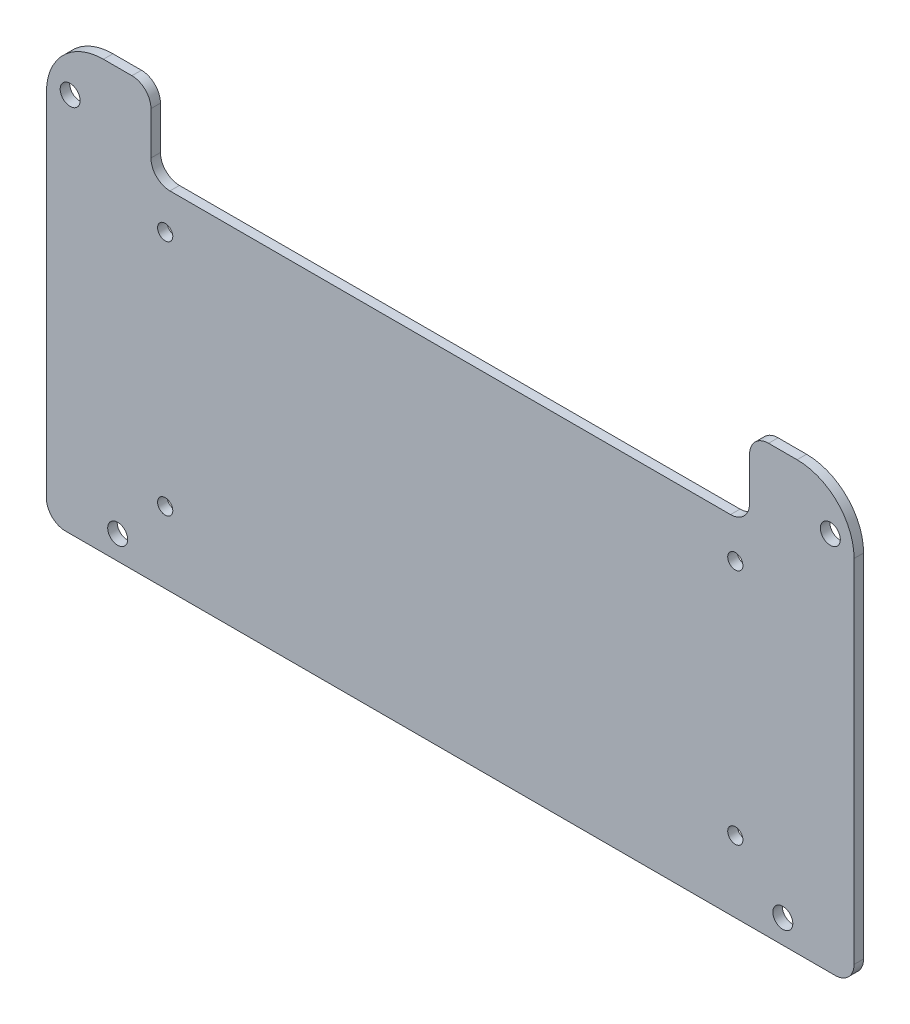
ISO-10303-21;
HEADER;
FILE_DESCRIPTION(('STEP AP214'),'2;1');
FILE_NAME('part.step','',(''),(''),'','','');
FILE_SCHEMA(('AUTOMOTIVE_DESIGN { 1 0 10303 214 1 1 1 1 }'));
ENDSEC;
DATA;
#1=APPLICATION_CONTEXT('core data for automotive mechanical design processes');
#2=APPLICATION_PROTOCOL_DEFINITION('international standard','automotive_design',2000,#1);
#3=PRODUCT_CONTEXT('',#1,'mechanical');
#4=PRODUCT('Part','Part','',(#3));
#5=PRODUCT_RELATED_PRODUCT_CATEGORY('part','',(#4));
#6=PRODUCT_DEFINITION_FORMATION('','',#4);
#7=PRODUCT_DEFINITION_CONTEXT('part definition',#1,'design');
#8=PRODUCT_DEFINITION('design','',#6,#7);
#9=PRODUCT_DEFINITION_SHAPE('','',#8);
#10=(LENGTH_UNIT() NAMED_UNIT(*) SI_UNIT(.MILLI.,.METRE.));
#11=(NAMED_UNIT(*) PLANE_ANGLE_UNIT() SI_UNIT($,.RADIAN.));
#12=(NAMED_UNIT(*) SI_UNIT($,.STERADIAN.) SOLID_ANGLE_UNIT());
#13=UNCERTAINTY_MEASURE_WITH_UNIT(LENGTH_MEASURE(1.E-05),#10,'distance_accuracy_value','');
#14=(GEOMETRIC_REPRESENTATION_CONTEXT(3) GLOBAL_UNCERTAINTY_ASSIGNED_CONTEXT((#13)) GLOBAL_UNIT_ASSIGNED_CONTEXT((#10,
#11,#12)) REPRESENTATION_CONTEXT('',''));
#15=CARTESIAN_POINT('',(0.,0.,0.));
#16=DIRECTION('',(0.,0.,1.));
#17=DIRECTION('',(1.,0.,0.));
#18=AXIS2_PLACEMENT_3D('',#15,#16,#17);
#19=CARTESIAN_POINT('',(-95.625,57.7896341463415,2.));
#20=DIRECTION('',(0.,-1.,0.));
#21=DIRECTION('',(0.,0.,-1.));
#22=AXIS2_PLACEMENT_3D('',#19,#20,#21);
#23=PLANE('',#22);
#24=DIRECTION('',(-1.,0.,0.));
#25=VECTOR('',#24,1.);
#26=CARTESIAN_POINT('',(-95.625,57.7896341463415,0.));
#27=LINE('',#26,#25);
#28=CARTESIAN_POINT('',(-77.625,57.7896341463415,0.));
#29=VERTEX_POINT('',#28);
#30=CARTESIAN_POINT('',(-83.625,57.7896341463415,0.));
#31=VERTEX_POINT('',#30);
#32=EDGE_CURVE('E177',#29,#31,#27,.T.);
#33=ORIENTED_EDGE('',*,*,#32,.T.);
#34=DIRECTION('',(0.,0.,-1.));
#35=VECTOR('',#34,1.);
#36=CARTESIAN_POINT('',(-83.625,57.7896341463415,2.));
#37=LINE('',#36,#35);
#38=CARTESIAN_POINT('',(-83.625,57.7896341463415,2.));
#39=VERTEX_POINT('',#38);
#40=EDGE_CURVE('E253',#31,#39,#37,.F.);
#41=ORIENTED_EDGE('',*,*,#40,.T.);
#42=DIRECTION('',(-1.,0.,0.));
#43=VECTOR('',#42,1.);
#44=CARTESIAN_POINT('',(-95.625,57.7896341463415,2.));
#45=LINE('',#44,#43);
#46=CARTESIAN_POINT('',(-77.625,57.7896341463415,2.));
#47=VERTEX_POINT('',#46);
#48=EDGE_CURVE('E310',#47,#39,#45,.T.);
#49=ORIENTED_EDGE('',*,*,#48,.F.);
#50=DIRECTION('',(0.,0.,1.));
#51=VECTOR('',#50,1.);
#52=CARTESIAN_POINT('',(-77.625,57.7896341463415,2.));
#53=LINE('',#52,#51);
#54=EDGE_CURVE('E236',#47,#29,#53,.F.);
#55=ORIENTED_EDGE('',*,*,#54,.T.);
#56=EDGE_LOOP('',(#33,#41,#49,#55));
#57=FACE_BOUND('',#56,.T.);
#58=ADVANCED_FACE('F36',(#57),#23,.F.);
#59=CARTESIAN_POINT('',(-95.625,57.7896341463415,2.));
#60=DIRECTION('',(1.,0.,0.));
#61=DIRECTION('',(0.,1.,0.));
#62=AXIS2_PLACEMENT_3D('',#59,#60,#61);
#63=PLANE('',#62);
#64=DIRECTION('',(0.,-1.,0.));
#65=VECTOR('',#64,1.);
#66=CARTESIAN_POINT('',(-95.625,57.7896341463415,2.));
#67=LINE('',#66,#65);
#68=CARTESIAN_POINT('',(-95.625,45.7896341463415,2.));
#69=VERTEX_POINT('',#68);
#70=CARTESIAN_POINT('',(-95.625,-28.2103658536585,2.));
#71=VERTEX_POINT('',#70);
#72=EDGE_CURVE('E185',#69,#71,#67,.T.);
#73=ORIENTED_EDGE('',*,*,#72,.F.);
#74=DIRECTION('',(0.,0.,-1.));
#75=VECTOR('',#74,1.);
#76=CARTESIAN_POINT('',(-95.625,45.7896341463415,2.));
#77=LINE('',#76,#75);
#78=CARTESIAN_POINT('',(-95.625,45.7896341463415,0.));
#79=VERTEX_POINT('',#78);
#80=EDGE_CURVE('E246',#69,#79,#77,.T.);
#81=ORIENTED_EDGE('',*,*,#80,.T.);
#82=DIRECTION('',(0.,-1.,0.));
#83=VECTOR('',#82,1.);
#84=CARTESIAN_POINT('',(-95.625,57.7896341463415,0.));
#85=LINE('',#84,#83);
#86=CARTESIAN_POINT('',(-95.625,-28.2103658536585,0.));
#87=VERTEX_POINT('',#86);
#88=EDGE_CURVE('E175',#79,#87,#85,.T.);
#89=ORIENTED_EDGE('',*,*,#88,.T.);
#90=DIRECTION('',(0.,0.,-1.));
#91=VECTOR('',#90,1.);
#92=CARTESIAN_POINT('',(-95.625,-28.2103658536585,2.));
#93=LINE('',#92,#91);
#94=EDGE_CURVE('E156',#87,#71,#93,.F.);
#95=ORIENTED_EDGE('',*,*,#94,.T.);
#96=EDGE_LOOP('',(#73,#81,#89,#95));
#97=FACE_BOUND('',#96,.T.);
#98=ADVANCED_FACE('F322',(#97),#63,.F.);
#99=CARTESIAN_POINT('',(-95.625,-32.2103658536585,2.));
#100=DIRECTION('',(0.,1.,0.));
#101=DIRECTION('',(0.,0.,1.));
#102=AXIS2_PLACEMENT_3D('',#99,#100,#101);
#103=PLANE('',#102);
#104=DIRECTION('',(1.,0.,0.));
#105=VECTOR('',#104,1.);
#106=CARTESIAN_POINT('',(-95.625,-32.2103658536585,2.));
#107=LINE('',#106,#105);
#108=CARTESIAN_POINT('',(-91.625,-32.2103658536585,2.));
#109=VERTEX_POINT('',#108);
#110=CARTESIAN_POINT('',(70.375,-32.2103658536585,2.));
#111=VERTEX_POINT('',#110);
#112=EDGE_CURVE('E169',#109,#111,#107,.T.);
#113=ORIENTED_EDGE('',*,*,#112,.F.);
#114=DIRECTION('',(0.,0.,-1.));
#115=VECTOR('',#114,1.);
#116=CARTESIAN_POINT('',(-91.625,-32.2103658536585,2.));
#117=LINE('',#116,#115);
#118=CARTESIAN_POINT('',(-91.625,-32.2103658536585,0.));
#119=VERTEX_POINT('',#118);
#120=EDGE_CURVE('E154',#109,#119,#117,.T.);
#121=ORIENTED_EDGE('',*,*,#120,.T.);
#122=DIRECTION('',(1.,0.,0.));
#123=VECTOR('',#122,1.);
#124=CARTESIAN_POINT('',(-95.625,-32.2103658536585,0.));
#125=LINE('',#124,#123);
#126=CARTESIAN_POINT('',(70.375,-32.2103658536585,0.));
#127=VERTEX_POINT('',#126);
#128=EDGE_CURVE('E166',#119,#127,#125,.T.);
#129=ORIENTED_EDGE('',*,*,#128,.T.);
#130=DIRECTION('',(0.,0.,-1.));
#131=VECTOR('',#130,1.);
#132=CARTESIAN_POINT('',(70.375,-32.2103658536585,2.));
#133=LINE('',#132,#131);
#134=EDGE_CURVE('E170',#127,#111,#133,.F.);
#135=ORIENTED_EDGE('',*,*,#134,.T.);
#136=EDGE_LOOP('',(#113,#121,#129,#135));
#137=FACE_BOUND('',#136,.T.);
#138=ADVANCED_FACE('F165',(#137),#103,.F.);
#139=CARTESIAN_POINT('',(74.375,57.7896341463415,2.));
#140=DIRECTION('',(-1.,0.,0.));
#141=DIRECTION('',(0.,0.,1.));
#142=AXIS2_PLACEMENT_3D('',#139,#140,#141);
#143=PLANE('',#142);
#144=DIRECTION('',(0.,1.,0.));
#145=VECTOR('',#144,1.);
#146=CARTESIAN_POINT('',(74.375,57.7896341463415,0.));
#147=LINE('',#146,#145);
#148=CARTESIAN_POINT('',(74.375,-28.2103658536585,0.));
#149=VERTEX_POINT('',#148);
#150=CARTESIAN_POINT('',(74.375,45.7896341463415,0.));
#151=VERTEX_POINT('',#150);
#152=EDGE_CURVE('E174',#149,#151,#147,.T.);
#153=ORIENTED_EDGE('',*,*,#152,.T.);
#154=DIRECTION('',(0.,0.,-1.));
#155=VECTOR('',#154,1.);
#156=CARTESIAN_POINT('',(74.375,45.7896341463415,2.));
#157=LINE('',#156,#155);
#158=CARTESIAN_POINT('',(74.375,45.7896341463415,2.));
#159=VERTEX_POINT('',#158);
#160=EDGE_CURVE('E11',#151,#159,#157,.F.);
#161=ORIENTED_EDGE('',*,*,#160,.T.);
#162=DIRECTION('',(0.,1.,0.));
#163=VECTOR('',#162,1.);
#164=CARTESIAN_POINT('',(74.375,57.7896341463415,2.));
#165=LINE('',#164,#163);
#166=CARTESIAN_POINT('',(74.375,-28.2103658536585,2.));
#167=VERTEX_POINT('',#166);
#168=EDGE_CURVE('E309',#167,#159,#165,.T.);
#169=ORIENTED_EDGE('',*,*,#168,.F.);
#170=DIRECTION('',(0.,0.,-1.));
#171=VECTOR('',#170,1.);
#172=CARTESIAN_POINT('',(74.375,-28.2103658536585,2.));
#173=LINE('',#172,#171);
#174=EDGE_CURVE('E206',#167,#149,#173,.T.);
#175=ORIENTED_EDGE('',*,*,#174,.T.);
#176=EDGE_LOOP('',(#153,#161,#169,#175));
#177=FACE_BOUND('',#176,.T.);
#178=ADVANCED_FACE('F395',(#177),#143,.F.);
#179=CARTESIAN_POINT('',(62.3750000000001,57.7896341463415,2.));
#180=VERTEX_POINT('',#179);
#181=CARTESIAN_POINT('',(56.375,57.7896341463415,2.));
#182=VERTEX_POINT('',#181);
#183=EDGE_CURVE('E198',#180,#182,#45,.T.);
#184=ORIENTED_EDGE('',*,*,#183,.F.);
#185=DIRECTION('',(0.,0.,-1.));
#186=VECTOR('',#185,1.);
#187=CARTESIAN_POINT('',(62.3750000000001,57.7896341463415,2.));
#188=LINE('',#187,#186);
#189=CARTESIAN_POINT('',(62.3750000000001,57.7896341463415,0.));
#190=VERTEX_POINT('',#189);
#191=EDGE_CURVE('E44',#180,#190,#188,.T.);
#192=ORIENTED_EDGE('',*,*,#191,.T.);
#193=CARTESIAN_POINT('',(56.375,57.7896341463415,0.));
#194=VERTEX_POINT('',#193);
#195=EDGE_CURVE('E183',#190,#194,#27,.T.);
#196=ORIENTED_EDGE('',*,*,#195,.T.);
#197=DIRECTION('',(0.,0.,1.));
#198=VECTOR('',#197,1.);
#199=CARTESIAN_POINT('',(56.375,57.7896341463415,2.));
#200=LINE('',#199,#198);
#201=EDGE_CURVE('E219',#194,#182,#200,.T.);
#202=ORIENTED_EDGE('',*,*,#201,.T.);
#203=EDGE_LOOP('',(#184,#192,#196,#202));
#204=FACE_BOUND('',#203,.T.);
#205=ADVANCED_FACE('F261',(#204),#23,.F.);
#206=CARTESIAN_POINT('',(0.,0.,2.));
#207=DIRECTION('',(0.,0.,1.));
#208=DIRECTION('',(1.,0.,0.));
#209=AXIS2_PLACEMENT_3D('',#206,#207,#208);
#210=PLANE('',#209);
#211=CARTESIAN_POINT('',(-70.625,32.7896341463415,2.));
#212=DIRECTION('',(0.,0.,1.));
#213=DIRECTION('',(-1.,0.,0.));
#214=AXIS2_PLACEMENT_3D('',#211,#212,#213);
#215=CIRCLE('',#214,1.60000000000001);
#216=CARTESIAN_POINT('',(-72.225,32.7896341463415,2.));
#217=VERTEX_POINT('',#216);
#218=EDGE_CURVE('E342',#217,#217,#215,.T.);
#219=ORIENTED_EDGE('',*,*,#218,.F.);
#220=EDGE_LOOP('',(#219));
#221=FACE_BOUND('',#220,.T.);
#222=CARTESIAN_POINT('',(-70.625,-17.2103658536585,2.));
#223=DIRECTION('',(0.,0.,1.));
#224=DIRECTION('',(-1.,0.,0.));
#225=AXIS2_PLACEMENT_3D('',#222,#223,#224);
#226=CIRCLE('',#225,1.59999999999999);
#227=CARTESIAN_POINT('',(-72.225,-17.2103658536585,2.));
#228=VERTEX_POINT('',#227);
#229=EDGE_CURVE('E348',#228,#228,#226,.T.);
#230=ORIENTED_EDGE('',*,*,#229,.F.);
#231=EDGE_LOOP('',(#230));
#232=FACE_BOUND('',#231,.T.);
#233=CARTESIAN_POINT('',(49.3750000000001,-17.2103658536585,2.));
#234=DIRECTION('',(0.,0.,1.));
#235=DIRECTION('',(1.,0.,0.));
#236=AXIS2_PLACEMENT_3D('',#233,#234,#235);
#237=CIRCLE('',#236,1.6);
#238=CARTESIAN_POINT('',(50.9750000000001,-17.2103658536585,2.));
#239=VERTEX_POINT('',#238);
#240=EDGE_CURVE('E354',#239,#239,#237,.T.);
#241=ORIENTED_EDGE('',*,*,#240,.F.);
#242=EDGE_LOOP('',(#241));
#243=FACE_BOUND('',#242,.T.);
#244=CARTESIAN_POINT('',(49.375,32.7896341463415,2.));
#245=DIRECTION('',(0.,0.,1.));
#246=DIRECTION('',(1.,0.,0.));
#247=AXIS2_PLACEMENT_3D('',#244,#245,#246);
#248=CIRCLE('',#247,1.60000000000001);
#249=CARTESIAN_POINT('',(50.975,32.7896341463415,2.));
#250=VERTEX_POINT('',#249);
#251=EDGE_CURVE('E288',#250,#250,#248,.T.);
#252=ORIENTED_EDGE('',*,*,#251,.F.);
#253=EDGE_LOOP('',(#252));
#254=FACE_BOUND('',#253,.T.);
#255=ORIENTED_EDGE('',*,*,#48,.T.);
#256=CARTESIAN_POINT('',(-83.625,45.7896341463415,2.));
#257=DIRECTION('',(0.,0.,1.));
#258=DIRECTION('',(1.,0.,0.));
#259=AXIS2_PLACEMENT_3D('',#256,#257,#258);
#260=CIRCLE('',#259,12.);
#261=EDGE_CURVE('E256',#39,#69,#260,.T.);
#262=ORIENTED_EDGE('',*,*,#261,.T.);
#263=ORIENTED_EDGE('',*,*,#72,.T.);
#264=CARTESIAN_POINT('',(-91.625,-28.2103658536585,2.));
#265=DIRECTION('',(0.,0.,1.));
#266=DIRECTION('',(1.,0.,0.));
#267=AXIS2_PLACEMENT_3D('',#264,#265,#266);
#268=CIRCLE('',#267,4.);
#269=EDGE_CURVE('E204',#71,#109,#268,.T.);
#270=ORIENTED_EDGE('',*,*,#269,.T.);
#271=ORIENTED_EDGE('',*,*,#112,.T.);
#272=CARTESIAN_POINT('',(70.375,-28.2103658536585,2.));
#273=DIRECTION('',(0.,0.,1.));
#274=DIRECTION('',(1.,0.,0.));
#275=AXIS2_PLACEMENT_3D('',#272,#273,#274);
#276=CIRCLE('',#275,4.);
#277=EDGE_CURVE('E202',#111,#167,#276,.T.);
#278=ORIENTED_EDGE('',*,*,#277,.T.);
#279=ORIENTED_EDGE('',*,*,#168,.T.);
#280=CARTESIAN_POINT('',(62.3750000000001,45.7896341463415,2.));
#281=DIRECTION('',(0.,0.,1.));
#282=DIRECTION('',(1.,0.,0.));
#283=AXIS2_PLACEMENT_3D('',#280,#281,#282);
#284=CIRCLE('',#283,12.);
#285=EDGE_CURVE('E56',#159,#180,#284,.T.);
#286=ORIENTED_EDGE('',*,*,#285,.T.);
#287=ORIENTED_EDGE('',*,*,#183,.T.);
#288=CARTESIAN_POINT('',(56.375,53.7896341463415,2.));
#289=DIRECTION('',(0.,0.,1.));
#290=DIRECTION('',(1.,0.,0.));
#291=AXIS2_PLACEMENT_3D('',#288,#289,#290);
#292=CIRCLE('',#291,4.);
#293=CARTESIAN_POINT('',(52.375,53.7896341463415,2.));
#294=VERTEX_POINT('',#293);
#295=EDGE_CURVE('E224',#182,#294,#292,.T.);
#296=ORIENTED_EDGE('',*,*,#295,.T.);
#297=DIRECTION('',(0.,1.,0.));
#298=VECTOR('',#297,1.);
#299=CARTESIAN_POINT('',(52.375,47.7896341463415,2.));
#300=LINE('',#299,#298);
#301=CARTESIAN_POINT('',(52.375,44.7896341463415,2.));
#302=VERTEX_POINT('',#301);
#303=EDGE_CURVE('E277',#302,#294,#300,.T.);
#304=ORIENTED_EDGE('',*,*,#303,.F.);
#305=CARTESIAN_POINT('',(48.375,44.7896341463415,2.));
#306=DIRECTION('',(0.,0.,1.));
#307=DIRECTION('',(1.,0.,0.));
#308=AXIS2_PLACEMENT_3D('',#305,#306,#307);
#309=CIRCLE('',#308,4.);
#310=CARTESIAN_POINT('',(48.375,40.7896341463415,2.));
#311=VERTEX_POINT('',#310);
#312=EDGE_CURVE('E238',#302,#311,#309,.F.);
#313=ORIENTED_EDGE('',*,*,#312,.T.);
#314=DIRECTION('',(1.,0.,0.));
#315=VECTOR('',#314,1.);
#316=CARTESIAN_POINT('',(-73.625,40.7896341463415,2.));
#317=LINE('',#316,#315);
#318=CARTESIAN_POINT('',(-69.625,40.7896341463415,2.));
#319=VERTEX_POINT('',#318);
#320=EDGE_CURVE('E285',#319,#311,#317,.T.);
#321=ORIENTED_EDGE('',*,*,#320,.F.);
#322=CARTESIAN_POINT('',(-69.625,44.7896341463415,2.));
#323=DIRECTION('',(0.,0.,1.));
#324=DIRECTION('',(1.,0.,0.));
#325=AXIS2_PLACEMENT_3D('',#322,#323,#324);
#326=CIRCLE('',#325,4.);
#327=CARTESIAN_POINT('',(-73.625,44.7896341463415,2.));
#328=VERTEX_POINT('',#327);
#329=EDGE_CURVE('E242',#319,#328,#326,.F.);
#330=ORIENTED_EDGE('',*,*,#329,.T.);
#331=DIRECTION('',(0.,-1.,0.));
#332=VECTOR('',#331,1.);
#333=CARTESIAN_POINT('',(-73.625,57.7896341463415,2.));
#334=LINE('',#333,#332);
#335=CARTESIAN_POINT('',(-73.625,53.7896341463415,2.));
#336=VERTEX_POINT('',#335);
#337=EDGE_CURVE('E281',#336,#328,#334,.T.);
#338=ORIENTED_EDGE('',*,*,#337,.F.);
#339=CARTESIAN_POINT('',(-77.625,53.7896341463415,2.));
#340=DIRECTION('',(0.,0.,1.));
#341=DIRECTION('',(1.,0.,0.));
#342=AXIS2_PLACEMENT_3D('',#339,#340,#341);
#343=CIRCLE('',#342,4.);
#344=EDGE_CURVE('E222',#336,#47,#343,.T.);
#345=ORIENTED_EDGE('',*,*,#344,.T.);
#346=EDGE_LOOP('',(#255,#262,#263,#270,#271,#278,#279,#286,#287,#296,#304,#313,#321,#330,#338,#345));
#347=FACE_BOUND('',#346,.T.);
#348=CARTESIAN_POINT('',(-90.625,47.7896341463415,2.));
#349=DIRECTION('',(0.,0.,1.));
#350=DIRECTION('',(1.,0.,0.));
#351=AXIS2_PLACEMENT_3D('',#348,#349,#350);
#352=CIRCLE('',#351,2.1);
#353=CARTESIAN_POINT('',(-88.525,47.7896341463415,2.));
#354=VERTEX_POINT('',#353);
#355=EDGE_CURVE('E302',#354,#354,#352,.T.);
#356=ORIENTED_EDGE('',*,*,#355,.F.);
#357=EDGE_LOOP('',(#356));
#358=FACE_BOUND('',#357,.T.);
#359=CARTESIAN_POINT('',(69.375,47.7896341463415,2.));
#360=DIRECTION('',(0.,0.,1.));
#361=DIRECTION('',(1.,0.,0.));
#362=AXIS2_PLACEMENT_3D('',#359,#360,#361);
#363=CIRCLE('',#362,2.1);
#364=CARTESIAN_POINT('',(71.475,47.7896341463415,2.));
#365=VERTEX_POINT('',#364);
#366=EDGE_CURVE('E299',#365,#365,#363,.T.);
#367=ORIENTED_EDGE('',*,*,#366,.F.);
#368=EDGE_LOOP('',(#367));
#369=FACE_BOUND('',#368,.T.);
#370=CARTESIAN_POINT('',(-80.6249999999999,-27.2103658536585,2.));
#371=DIRECTION('',(0.,0.,1.));
#372=DIRECTION('',(-1.,0.,0.));
#373=AXIS2_PLACEMENT_3D('',#370,#371,#372);
#374=CIRCLE('',#373,2.1);
#375=CARTESIAN_POINT('',(-82.725,-27.2103658536585,2.));
#376=VERTEX_POINT('',#375);
#377=EDGE_CURVE('E296',#376,#376,#374,.T.);
#378=ORIENTED_EDGE('',*,*,#377,.F.);
#379=EDGE_LOOP('',(#378));
#380=FACE_BOUND('',#379,.T.);
#381=CARTESIAN_POINT('',(59.375,-27.2103658536585,2.));
#382=DIRECTION('',(0.,0.,1.));
#383=DIRECTION('',(1.,0.,0.));
#384=AXIS2_PLACEMENT_3D('',#381,#382,#383);
#385=CIRCLE('',#384,2.1);
#386=CARTESIAN_POINT('',(61.475,-27.2103658536585,2.));
#387=VERTEX_POINT('',#386);
#388=EDGE_CURVE('E190',#387,#387,#385,.T.);
#389=ORIENTED_EDGE('',*,*,#388,.F.);
#390=EDGE_LOOP('',(#389));
#391=FACE_BOUND('',#390,.T.);
#392=ADVANCED_FACE('F275',(#221,#232,#243,#254,#347,#358,#369,#380,#391),#210,.T.);
#393=CARTESIAN_POINT('',(0.,0.,0.));
#394=DIRECTION('',(0.,0.,1.));
#395=DIRECTION('',(1.,0.,0.));
#396=AXIS2_PLACEMENT_3D('',#393,#394,#395);
#397=PLANE('',#396);
#398=CARTESIAN_POINT('',(-70.625,32.7896341463415,0.));
#399=DIRECTION('',(0.,0.,1.));
#400=DIRECTION('',(-1.,0.,0.));
#401=AXIS2_PLACEMENT_3D('',#398,#399,#400);
#402=CIRCLE('',#401,1.60000000000001);
#403=CARTESIAN_POINT('',(-72.225,32.7896341463415,0.));
#404=VERTEX_POINT('',#403);
#405=EDGE_CURVE('E345',#404,#404,#402,.T.);
#406=ORIENTED_EDGE('',*,*,#405,.T.);
#407=EDGE_LOOP('',(#406));
#408=FACE_BOUND('',#407,.T.);
#409=CARTESIAN_POINT('',(-70.625,-17.2103658536585,0.));
#410=DIRECTION('',(0.,0.,1.));
#411=DIRECTION('',(-1.,0.,0.));
#412=AXIS2_PLACEMENT_3D('',#409,#410,#411);
#413=CIRCLE('',#412,1.59999999999999);
#414=CARTESIAN_POINT('',(-72.225,-17.2103658536585,0.));
#415=VERTEX_POINT('',#414);
#416=EDGE_CURVE('E351',#415,#415,#413,.T.);
#417=ORIENTED_EDGE('',*,*,#416,.T.);
#418=EDGE_LOOP('',(#417));
#419=FACE_BOUND('',#418,.T.);
#420=CARTESIAN_POINT('',(49.3750000000001,-17.2103658536585,0.));
#421=DIRECTION('',(0.,0.,1.));
#422=DIRECTION('',(1.,0.,0.));
#423=AXIS2_PLACEMENT_3D('',#420,#421,#422);
#424=CIRCLE('',#423,1.6);
#425=CARTESIAN_POINT('',(50.9750000000001,-17.2103658536585,0.));
#426=VERTEX_POINT('',#425);
#427=EDGE_CURVE('E340',#426,#426,#424,.T.);
#428=ORIENTED_EDGE('',*,*,#427,.T.);
#429=EDGE_LOOP('',(#428));
#430=FACE_BOUND('',#429,.T.);
#431=CARTESIAN_POINT('',(49.375,32.7896341463415,0.));
#432=DIRECTION('',(0.,0.,1.));
#433=DIRECTION('',(1.,0.,0.));
#434=AXIS2_PLACEMENT_3D('',#431,#432,#433);
#435=CIRCLE('',#434,1.60000000000001);
#436=CARTESIAN_POINT('',(50.975,32.7896341463415,0.));
#437=VERTEX_POINT('',#436);
#438=EDGE_CURVE('E282',#437,#437,#435,.T.);
#439=ORIENTED_EDGE('',*,*,#438,.T.);
#440=EDGE_LOOP('',(#439));
#441=FACE_BOUND('',#440,.T.);
#442=CARTESIAN_POINT('',(-90.625,47.7896341463415,0.));
#443=DIRECTION('',(0.,0.,1.));
#444=DIRECTION('',(1.,0.,0.));
#445=AXIS2_PLACEMENT_3D('',#442,#443,#444);
#446=CIRCLE('',#445,2.1);
#447=CARTESIAN_POINT('',(-88.525,47.7896341463415,0.));
#448=VERTEX_POINT('',#447);
#449=EDGE_CURVE('E179',#448,#448,#446,.T.);
#450=ORIENTED_EDGE('',*,*,#449,.T.);
#451=EDGE_LOOP('',(#450));
#452=FACE_BOUND('',#451,.T.);
#453=CARTESIAN_POINT('',(69.375,47.7896341463415,0.));
#454=DIRECTION('',(0.,0.,1.));
#455=DIRECTION('',(1.,0.,0.));
#456=AXIS2_PLACEMENT_3D('',#453,#454,#455);
#457=CIRCLE('',#456,2.1);
#458=CARTESIAN_POINT('',(71.475,47.7896341463415,0.));
#459=VERTEX_POINT('',#458);
#460=EDGE_CURVE('E193',#459,#459,#457,.T.);
#461=ORIENTED_EDGE('',*,*,#460,.T.);
#462=EDGE_LOOP('',(#461));
#463=FACE_BOUND('',#462,.T.);
#464=CARTESIAN_POINT('',(-80.6249999999999,-27.2103658536585,0.));
#465=DIRECTION('',(0.,0.,1.));
#466=DIRECTION('',(1.,0.,0.));
#467=AXIS2_PLACEMENT_3D('',#464,#465,#466);
#468=CIRCLE('',#467,2.1);
#469=CARTESIAN_POINT('',(-78.5249999999999,-27.2103658536585,0.));
#470=VERTEX_POINT('',#469);
#471=EDGE_CURVE('E189',#470,#470,#468,.T.);
#472=ORIENTED_EDGE('',*,*,#471,.T.);
#473=EDGE_LOOP('',(#472));
#474=FACE_BOUND('',#473,.T.);
#475=CARTESIAN_POINT('',(59.375,-27.2103658536585,0.));
#476=DIRECTION('',(0.,0.,1.));
#477=DIRECTION('',(1.,0.,0.));
#478=AXIS2_PLACEMENT_3D('',#475,#476,#477);
#479=CIRCLE('',#478,2.1);
#480=CARTESIAN_POINT('',(61.475,-27.2103658536585,0.));
#481=VERTEX_POINT('',#480);
#482=EDGE_CURVE('E186',#481,#481,#479,.T.);
#483=ORIENTED_EDGE('',*,*,#482,.T.);
#484=EDGE_LOOP('',(#483));
#485=FACE_BOUND('',#484,.T.);
#486=ORIENTED_EDGE('',*,*,#88,.F.);
#487=CARTESIAN_POINT('',(-83.625,45.7896341463415,0.));
#488=DIRECTION('',(0.,0.,1.));
#489=DIRECTION('',(1.,0.,0.));
#490=AXIS2_PLACEMENT_3D('',#487,#488,#489);
#491=CIRCLE('',#490,12.);
#492=EDGE_CURVE('E251',#79,#31,#491,.F.);
#493=ORIENTED_EDGE('',*,*,#492,.T.);
#494=ORIENTED_EDGE('',*,*,#32,.F.);
#495=CARTESIAN_POINT('',(-77.625,53.7896341463415,0.));
#496=DIRECTION('',(0.,0.,1.));
#497=DIRECTION('',(1.,0.,0.));
#498=AXIS2_PLACEMENT_3D('',#495,#496,#497);
#499=CIRCLE('',#498,4.);
#500=CARTESIAN_POINT('',(-73.625,53.7896341463415,0.));
#501=VERTEX_POINT('',#500);
#502=EDGE_CURVE('E226',#29,#501,#499,.F.);
#503=ORIENTED_EDGE('',*,*,#502,.T.);
#504=DIRECTION('',(0.,-1.,0.));
#505=VECTOR('',#504,1.);
#506=CARTESIAN_POINT('',(-73.625,57.7896341463415,0.));
#507=LINE('',#506,#505);
#508=CARTESIAN_POINT('',(-73.625,44.7896341463415,0.));
#509=VERTEX_POINT('',#508);
#510=EDGE_CURVE('E331',#501,#509,#507,.T.);
#511=ORIENTED_EDGE('',*,*,#510,.T.);
#512=CARTESIAN_POINT('',(-69.625,44.7896341463415,0.));
#513=DIRECTION('',(0.,0.,1.));
#514=DIRECTION('',(1.,0.,0.));
#515=AXIS2_PLACEMENT_3D('',#512,#513,#514);
#516=CIRCLE('',#515,4.);
#517=CARTESIAN_POINT('',(-69.625,40.7896341463415,0.));
#518=VERTEX_POINT('',#517);
#519=EDGE_CURVE('E244',#509,#518,#516,.T.);
#520=ORIENTED_EDGE('',*,*,#519,.T.);
#521=DIRECTION('',(1.,0.,0.));
#522=VECTOR('',#521,1.);
#523=CARTESIAN_POINT('',(-73.625,40.7896341463415,0.));
#524=LINE('',#523,#522);
#525=CARTESIAN_POINT('',(48.375,40.7896341463415,0.));
#526=VERTEX_POINT('',#525);
#527=EDGE_CURVE('E291',#518,#526,#524,.T.);
#528=ORIENTED_EDGE('',*,*,#527,.T.);
#529=CARTESIAN_POINT('',(48.375,44.7896341463415,0.));
#530=DIRECTION('',(0.,0.,1.));
#531=DIRECTION('',(1.,0.,0.));
#532=AXIS2_PLACEMENT_3D('',#529,#530,#531);
#533=CIRCLE('',#532,4.);
#534=CARTESIAN_POINT('',(52.375,44.7896341463415,0.));
#535=VERTEX_POINT('',#534);
#536=EDGE_CURVE('E240',#526,#535,#533,.T.);
#537=ORIENTED_EDGE('',*,*,#536,.T.);
#538=DIRECTION('',(0.,1.,0.));
#539=VECTOR('',#538,1.);
#540=CARTESIAN_POINT('',(52.375,40.7896341463415,0.));
#541=LINE('',#540,#539);
#542=CARTESIAN_POINT('',(52.375,53.7896341463415,0.));
#543=VERTEX_POINT('',#542);
#544=EDGE_CURVE('E267',#535,#543,#541,.T.);
#545=ORIENTED_EDGE('',*,*,#544,.T.);
#546=CARTESIAN_POINT('',(56.375,53.7896341463415,0.));
#547=DIRECTION('',(0.,0.,1.));
#548=DIRECTION('',(1.,0.,0.));
#549=AXIS2_PLACEMENT_3D('',#546,#547,#548);
#550=CIRCLE('',#549,4.);
#551=EDGE_CURVE('E228',#543,#194,#550,.F.);
#552=ORIENTED_EDGE('',*,*,#551,.T.);
#553=ORIENTED_EDGE('',*,*,#195,.F.);
#554=CARTESIAN_POINT('',(62.3750000000001,45.7896341463415,0.));
#555=DIRECTION('',(0.,0.,1.));
#556=DIRECTION('',(1.,0.,0.));
#557=AXIS2_PLACEMENT_3D('',#554,#555,#556);
#558=CIRCLE('',#557,12.);
#559=EDGE_CURVE('E249',#190,#151,#558,.F.);
#560=ORIENTED_EDGE('',*,*,#559,.T.);
#561=ORIENTED_EDGE('',*,*,#152,.F.);
#562=CARTESIAN_POINT('',(70.375,-28.2103658536585,0.));
#563=DIRECTION('',(0.,0.,1.));
#564=DIRECTION('',(1.,0.,0.));
#565=AXIS2_PLACEMENT_3D('',#562,#563,#564);
#566=CIRCLE('',#565,4.);
#567=EDGE_CURVE('E160',#149,#127,#566,.F.);
#568=ORIENTED_EDGE('',*,*,#567,.T.);
#569=ORIENTED_EDGE('',*,*,#128,.F.);
#570=CARTESIAN_POINT('',(-91.625,-28.2103658536585,0.));
#571=DIRECTION('',(0.,0.,1.));
#572=DIRECTION('',(1.,0.,0.));
#573=AXIS2_PLACEMENT_3D('',#570,#571,#572);
#574=CIRCLE('',#573,4.);
#575=EDGE_CURVE('E150',#119,#87,#574,.F.);
#576=ORIENTED_EDGE('',*,*,#575,.T.);
#577=EDGE_LOOP('',(#486,#493,#494,#503,#511,#520,#528,#537,#545,#552,#553,#560,#561,#568,#569,#576));
#578=FACE_BOUND('',#577,.T.);
#579=ADVANCED_FACE('F172',(#408,#419,#430,#441,#452,#463,#474,#485,#578),#397,.F.);
#580=CARTESIAN_POINT('',(59.375,-27.2103658536585,-8.));
#581=DIRECTION('',(0.,0.,1.));
#582=DIRECTION('',(1.,0.,0.));
#583=AXIS2_PLACEMENT_3D('',#580,#581,#582);
#584=CYLINDRICAL_SURFACE('',#583,2.1);
#585=ORIENTED_EDGE('',*,*,#388,.T.);
#586=EDGE_LOOP('',(#585));
#587=FACE_BOUND('',#586,.T.);
#588=ORIENTED_EDGE('',*,*,#482,.F.);
#589=EDGE_LOOP('',(#588));
#590=FACE_BOUND('',#589,.T.);
#591=ADVANCED_FACE('F444',(#587,#590),#584,.F.);
#592=CARTESIAN_POINT('',(-80.6249999999999,-27.2103658536585,-8.));
#593=DIRECTION('',(0.,0.,1.));
#594=DIRECTION('',(1.,0.,0.));
#595=AXIS2_PLACEMENT_3D('',#592,#593,#594);
#596=CYLINDRICAL_SURFACE('',#595,2.1);
#597=ORIENTED_EDGE('',*,*,#377,.T.);
#598=EDGE_LOOP('',(#597));
#599=FACE_BOUND('',#598,.T.);
#600=ORIENTED_EDGE('',*,*,#471,.F.);
#601=EDGE_LOOP('',(#600));
#602=FACE_BOUND('',#601,.T.);
#603=ADVANCED_FACE('F580',(#599,#602),#596,.F.);
#604=CARTESIAN_POINT('',(69.375,47.7896341463415,-8.));
#605=DIRECTION('',(0.,0.,1.));
#606=DIRECTION('',(1.,0.,0.));
#607=AXIS2_PLACEMENT_3D('',#604,#605,#606);
#608=CYLINDRICAL_SURFACE('',#607,2.1);
#609=ORIENTED_EDGE('',*,*,#366,.T.);
#610=EDGE_LOOP('',(#609));
#611=FACE_BOUND('',#610,.T.);
#612=ORIENTED_EDGE('',*,*,#460,.F.);
#613=EDGE_LOOP('',(#612));
#614=FACE_BOUND('',#613,.T.);
#615=ADVANCED_FACE('F570',(#611,#614),#608,.F.);
#616=CARTESIAN_POINT('',(-90.625,47.7896341463415,-8.));
#617=DIRECTION('',(0.,0.,1.));
#618=DIRECTION('',(1.,0.,0.));
#619=AXIS2_PLACEMENT_3D('',#616,#617,#618);
#620=CYLINDRICAL_SURFACE('',#619,2.1);
#621=ORIENTED_EDGE('',*,*,#355,.T.);
#622=EDGE_LOOP('',(#621));
#623=FACE_BOUND('',#622,.T.);
#624=ORIENTED_EDGE('',*,*,#449,.F.);
#625=EDGE_LOOP('',(#624));
#626=FACE_BOUND('',#625,.T.);
#627=ADVANCED_FACE('F407',(#623,#626),#620,.F.);
#628=CARTESIAN_POINT('',(-91.625,-28.2103658536585,2.));
#629=DIRECTION('',(0.,0.,-1.));
#630=DIRECTION('',(-1.,0.,0.));
#631=AXIS2_PLACEMENT_3D('',#628,#629,#630);
#632=CYLINDRICAL_SURFACE('',#631,4.);
#633=ORIENTED_EDGE('',*,*,#269,.F.);
#634=ORIENTED_EDGE('',*,*,#94,.F.);
#635=ORIENTED_EDGE('',*,*,#575,.F.);
#636=ORIENTED_EDGE('',*,*,#120,.F.);
#637=EDGE_LOOP('',(#633,#634,#635,#636));
#638=FACE_BOUND('',#637,.T.);
#639=ADVANCED_FACE('F153',(#638),#632,.T.);
#640=CARTESIAN_POINT('',(70.375,-28.2103658536585,2.));
#641=DIRECTION('',(0.,0.,-1.));
#642=DIRECTION('',(-1.,0.,0.));
#643=AXIS2_PLACEMENT_3D('',#640,#641,#642);
#644=CYLINDRICAL_SURFACE('',#643,4.);
#645=ORIENTED_EDGE('',*,*,#277,.F.);
#646=ORIENTED_EDGE('',*,*,#134,.F.);
#647=ORIENTED_EDGE('',*,*,#567,.F.);
#648=ORIENTED_EDGE('',*,*,#174,.F.);
#649=EDGE_LOOP('',(#645,#646,#647,#648));
#650=FACE_BOUND('',#649,.T.);
#651=ADVANCED_FACE('F406',(#650),#644,.T.);
#652=CARTESIAN_POINT('',(-73.625,40.7896341463415,0.));
#653=DIRECTION('',(0.,-1.,0.));
#654=DIRECTION('',(0.,0.,-1.));
#655=AXIS2_PLACEMENT_3D('',#652,#653,#654);
#656=PLANE('',#655);
#657=ORIENTED_EDGE('',*,*,#320,.T.);
#658=DIRECTION('',(0.,0.,1.));
#659=VECTOR('',#658,1.);
#660=CARTESIAN_POINT('',(48.375,40.7896341463415,0.));
#661=LINE('',#660,#659);
#662=EDGE_CURVE('E217',#311,#526,#661,.F.);
#663=ORIENTED_EDGE('',*,*,#662,.T.);
#664=ORIENTED_EDGE('',*,*,#527,.F.);
#665=DIRECTION('',(0.,0.,1.));
#666=VECTOR('',#665,1.);
#667=CARTESIAN_POINT('',(-69.625,40.7896341463415,2.));
#668=LINE('',#667,#666);
#669=EDGE_CURVE('E214',#518,#319,#668,.T.);
#670=ORIENTED_EDGE('',*,*,#669,.T.);
#671=EDGE_LOOP('',(#657,#663,#664,#670));
#672=FACE_BOUND('',#671,.T.);
#673=ADVANCED_FACE('F410',(#672),#656,.F.);
#674=CARTESIAN_POINT('',(-73.625,57.7896341463415,0.));
#675=DIRECTION('',(-1.,0.,0.));
#676=DIRECTION('',(0.,-1.,0.));
#677=AXIS2_PLACEMENT_3D('',#674,#675,#676);
#678=PLANE('',#677);
#679=ORIENTED_EDGE('',*,*,#337,.T.);
#680=DIRECTION('',(0.,0.,1.));
#681=VECTOR('',#680,1.);
#682=CARTESIAN_POINT('',(-73.625,44.7896341463415,0.));
#683=LINE('',#682,#681);
#684=EDGE_CURVE('E234',#328,#509,#683,.F.);
#685=ORIENTED_EDGE('',*,*,#684,.T.);
#686=ORIENTED_EDGE('',*,*,#510,.F.);
#687=DIRECTION('',(0.,0.,1.));
#688=VECTOR('',#687,1.);
#689=CARTESIAN_POINT('',(-73.625,53.7896341463415,0.));
#690=LINE('',#689,#688);
#691=EDGE_CURVE('E231',#501,#336,#690,.T.);
#692=ORIENTED_EDGE('',*,*,#691,.T.);
#693=EDGE_LOOP('',(#679,#685,#686,#692));
#694=FACE_BOUND('',#693,.T.);
#695=ADVANCED_FACE('F334',(#694),#678,.F.);
#696=CARTESIAN_POINT('',(52.375,47.7896341463415,0.));
#697=DIRECTION('',(1.,0.,0.));
#698=DIRECTION('',(0.,0.,-1.));
#699=AXIS2_PLACEMENT_3D('',#696,#697,#698);
#700=PLANE('',#699);
#701=ORIENTED_EDGE('',*,*,#544,.F.);
#702=DIRECTION('',(0.,0.,1.));
#703=VECTOR('',#702,1.);
#704=CARTESIAN_POINT('',(52.375,44.7896341463415,2.));
#705=LINE('',#704,#703);
#706=EDGE_CURVE('E211',#535,#302,#705,.T.);
#707=ORIENTED_EDGE('',*,*,#706,.T.);
#708=ORIENTED_EDGE('',*,*,#303,.T.);
#709=DIRECTION('',(0.,0.,1.));
#710=VECTOR('',#709,1.);
#711=CARTESIAN_POINT('',(52.375,53.7896341463415,0.));
#712=LINE('',#711,#710);
#713=EDGE_CURVE('E209',#294,#543,#712,.F.);
#714=ORIENTED_EDGE('',*,*,#713,.T.);
#715=EDGE_LOOP('',(#701,#707,#708,#714));
#716=FACE_BOUND('',#715,.T.);
#717=ADVANCED_FACE('F279',(#716),#700,.F.);
#718=CARTESIAN_POINT('',(49.375,32.7896341463415,0.));
#719=DIRECTION('',(0.,0.,1.));
#720=DIRECTION('',(1.,0.,0.));
#721=AXIS2_PLACEMENT_3D('',#718,#719,#720);
#722=CYLINDRICAL_SURFACE('',#721,1.60000000000001);
#723=ORIENTED_EDGE('',*,*,#438,.F.);
#724=EDGE_LOOP('',(#723));
#725=FACE_BOUND('',#724,.T.);
#726=ORIENTED_EDGE('',*,*,#251,.T.);
#727=EDGE_LOOP('',(#726));
#728=FACE_BOUND('',#727,.T.);
#729=ADVANCED_FACE('F366',(#725,#728),#722,.F.);
#730=CARTESIAN_POINT('',(49.3750000000001,-17.2103658536585,0.));
#731=DIRECTION('',(0.,0.,1.));
#732=DIRECTION('',(1.,0.,0.));
#733=AXIS2_PLACEMENT_3D('',#730,#731,#732);
#734=CYLINDRICAL_SURFACE('',#733,1.6);
#735=ORIENTED_EDGE('',*,*,#427,.F.);
#736=EDGE_LOOP('',(#735));
#737=FACE_BOUND('',#736,.T.);
#738=ORIENTED_EDGE('',*,*,#240,.T.);
#739=EDGE_LOOP('',(#738));
#740=FACE_BOUND('',#739,.T.);
#741=ADVANCED_FACE('F362',(#737,#740),#734,.F.);
#742=CARTESIAN_POINT('',(-70.625,-17.2103658536585,0.));
#743=DIRECTION('',(0.,0.,1.));
#744=DIRECTION('',(1.,0.,0.));
#745=AXIS2_PLACEMENT_3D('',#742,#743,#744);
#746=CYLINDRICAL_SURFACE('',#745,1.59999999999999);
#747=ORIENTED_EDGE('',*,*,#416,.F.);
#748=EDGE_LOOP('',(#747));
#749=FACE_BOUND('',#748,.T.);
#750=ORIENTED_EDGE('',*,*,#229,.T.);
#751=EDGE_LOOP('',(#750));
#752=FACE_BOUND('',#751,.T.);
#753=ADVANCED_FACE('F365',(#749,#752),#746,.F.);
#754=CARTESIAN_POINT('',(-70.625,32.7896341463415,0.));
#755=DIRECTION('',(0.,0.,1.));
#756=DIRECTION('',(1.,0.,0.));
#757=AXIS2_PLACEMENT_3D('',#754,#755,#756);
#758=CYLINDRICAL_SURFACE('',#757,1.60000000000001);
#759=ORIENTED_EDGE('',*,*,#405,.F.);
#760=EDGE_LOOP('',(#759));
#761=FACE_BOUND('',#760,.T.);
#762=ORIENTED_EDGE('',*,*,#218,.T.);
#763=EDGE_LOOP('',(#762));
#764=FACE_BOUND('',#763,.T.);
#765=ADVANCED_FACE('F415',(#761,#764),#758,.F.);
#766=CARTESIAN_POINT('',(48.375,44.7896341463415,0.));
#767=DIRECTION('',(0.,0.,-1.));
#768=DIRECTION('',(-1.,0.,0.));
#769=AXIS2_PLACEMENT_3D('',#766,#767,#768);
#770=CYLINDRICAL_SURFACE('',#769,4.);
#771=ORIENTED_EDGE('',*,*,#536,.F.);
#772=ORIENTED_EDGE('',*,*,#662,.F.);
#773=ORIENTED_EDGE('',*,*,#312,.F.);
#774=ORIENTED_EDGE('',*,*,#706,.F.);
#775=EDGE_LOOP('',(#771,#772,#773,#774));
#776=FACE_BOUND('',#775,.T.);
#777=ADVANCED_FACE('F412',(#776),#770,.F.);
#778=CARTESIAN_POINT('',(56.375,53.7896341463415,2.));
#779=DIRECTION('',(0.,0.,1.));
#780=DIRECTION('',(1.,0.,0.));
#781=AXIS2_PLACEMENT_3D('',#778,#779,#780);
#782=CYLINDRICAL_SURFACE('',#781,4.);
#783=ORIENTED_EDGE('',*,*,#551,.F.);
#784=ORIENTED_EDGE('',*,*,#713,.F.);
#785=ORIENTED_EDGE('',*,*,#295,.F.);
#786=ORIENTED_EDGE('',*,*,#201,.F.);
#787=EDGE_LOOP('',(#783,#784,#785,#786));
#788=FACE_BOUND('',#787,.T.);
#789=ADVANCED_FACE('F271',(#788),#782,.T.);
#790=CARTESIAN_POINT('',(-69.625,44.7896341463415,0.));
#791=DIRECTION('',(0.,0.,-1.));
#792=DIRECTION('',(-1.,0.,0.));
#793=AXIS2_PLACEMENT_3D('',#790,#791,#792);
#794=CYLINDRICAL_SURFACE('',#793,4.);
#795=ORIENTED_EDGE('',*,*,#519,.F.);
#796=ORIENTED_EDGE('',*,*,#684,.F.);
#797=ORIENTED_EDGE('',*,*,#329,.F.);
#798=ORIENTED_EDGE('',*,*,#669,.F.);
#799=EDGE_LOOP('',(#795,#796,#797,#798));
#800=FACE_BOUND('',#799,.T.);
#801=ADVANCED_FACE('F419',(#800),#794,.F.);
#802=CARTESIAN_POINT('',(-77.625,53.7896341463415,0.));
#803=DIRECTION('',(0.,0.,1.));
#804=DIRECTION('',(1.,0.,0.));
#805=AXIS2_PLACEMENT_3D('',#802,#803,#804);
#806=CYLINDRICAL_SURFACE('',#805,4.);
#807=ORIENTED_EDGE('',*,*,#502,.F.);
#808=ORIENTED_EDGE('',*,*,#54,.F.);
#809=ORIENTED_EDGE('',*,*,#344,.F.);
#810=ORIENTED_EDGE('',*,*,#691,.F.);
#811=EDGE_LOOP('',(#807,#808,#809,#810));
#812=FACE_BOUND('',#811,.T.);
#813=ADVANCED_FACE('F327',(#812),#806,.T.);
#814=CARTESIAN_POINT('',(-83.625,45.7896341463415,2.));
#815=DIRECTION('',(0.,0.,-1.));
#816=DIRECTION('',(-1.,0.,0.));
#817=AXIS2_PLACEMENT_3D('',#814,#815,#816);
#818=CYLINDRICAL_SURFACE('',#817,12.);
#819=ORIENTED_EDGE('',*,*,#261,.F.);
#820=ORIENTED_EDGE('',*,*,#40,.F.);
#821=ORIENTED_EDGE('',*,*,#492,.F.);
#822=ORIENTED_EDGE('',*,*,#80,.F.);
#823=EDGE_LOOP('',(#819,#820,#821,#822));
#824=FACE_BOUND('',#823,.T.);
#825=ADVANCED_FACE('F320',(#824),#818,.T.);
#826=CARTESIAN_POINT('',(62.3750000000001,45.7896341463415,2.));
#827=DIRECTION('',(0.,0.,-1.));
#828=DIRECTION('',(-1.,0.,0.));
#829=AXIS2_PLACEMENT_3D('',#826,#827,#828);
#830=CYLINDRICAL_SURFACE('',#829,12.);
#831=ORIENTED_EDGE('',*,*,#285,.F.);
#832=ORIENTED_EDGE('',*,*,#160,.F.);
#833=ORIENTED_EDGE('',*,*,#559,.F.);
#834=ORIENTED_EDGE('',*,*,#191,.F.);
#835=EDGE_LOOP('',(#831,#832,#833,#834));
#836=FACE_BOUND('',#835,.T.);
#837=ADVANCED_FACE('F38',(#836),#830,.T.);
#838=CLOSED_SHELL('',(#58,#98,#138,#178,#205,#392,#579,#591,#603,#615,#627,#639,#651,#673,#695,
#717,#729,#741,#753,#765,#777,#789,#801,#813,#825,#837));
#839=MANIFOLD_SOLID_BREP('B2',#838);
#840=ADVANCED_BREP_SHAPE_REPRESENTATION('',(#18,#839),#14);
#841=SHAPE_DEFINITION_REPRESENTATION(#9,#840);
ENDSEC;
END-ISO-10303-21;
